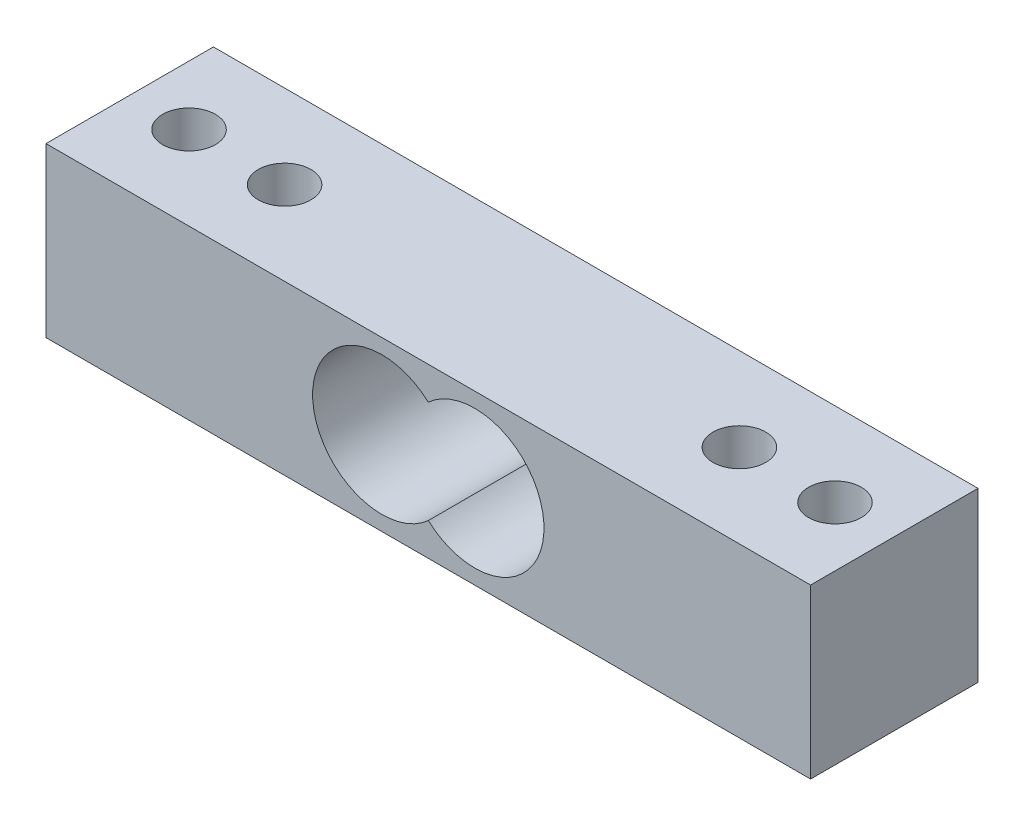
ISO-10303-21;
HEADER;
FILE_DESCRIPTION(('STEP AP214'),'2;1');
FILE_NAME('part.step','',(''),(''),'','','');
FILE_SCHEMA(('AUTOMOTIVE_DESIGN { 1 0 10303 214 1 1 1 1 }'));
ENDSEC;
DATA;
#1=APPLICATION_CONTEXT('core data for automotive mechanical design processes');
#2=APPLICATION_PROTOCOL_DEFINITION('international standard','automotive_design',2000,#1);
#3=PRODUCT_CONTEXT('',#1,'mechanical');
#4=PRODUCT('Part','Part','',(#3));
#5=PRODUCT_RELATED_PRODUCT_CATEGORY('part','',(#4));
#6=PRODUCT_DEFINITION_FORMATION('','',#4);
#7=PRODUCT_DEFINITION_CONTEXT('part definition',#1,'design');
#8=PRODUCT_DEFINITION('design','',#6,#7);
#9=PRODUCT_DEFINITION_SHAPE('','',#8);
#10=(LENGTH_UNIT() NAMED_UNIT(*) SI_UNIT(.MILLI.,.METRE.));
#11=(NAMED_UNIT(*) PLANE_ANGLE_UNIT() SI_UNIT($,.RADIAN.));
#12=(NAMED_UNIT(*) SI_UNIT($,.STERADIAN.) SOLID_ANGLE_UNIT());
#13=UNCERTAINTY_MEASURE_WITH_UNIT(LENGTH_MEASURE(1.E-05),#10,'distance_accuracy_value','');
#14=(GEOMETRIC_REPRESENTATION_CONTEXT(3) GLOBAL_UNCERTAINTY_ASSIGNED_CONTEXT((#13)) GLOBAL_UNIT_ASSIGNED_CONTEXT((#10,
#11,#12)) REPRESENTATION_CONTEXT('',''));
#15=CARTESIAN_POINT('',(0.,0.,0.));
#16=DIRECTION('',(0.,0.,1.));
#17=DIRECTION('',(1.,0.,0.));
#18=AXIS2_PLACEMENT_3D('',#15,#16,#17);
#19=CARTESIAN_POINT('',(0.,12.75,0.));
#20=DIRECTION('',(0.,-1.,0.));
#21=DIRECTION('',(0.,0.,-1.));
#22=AXIS2_PLACEMENT_3D('',#19,#20,#21);
#23=PLANE('',#22);
#24=DIRECTION('',(0.,0.,-1.));
#25=VECTOR('',#24,1.);
#26=CARTESIAN_POINT('',(29.,12.75,6.35));
#27=LINE('',#26,#25);
#28=CARTESIAN_POINT('',(29.,12.75,6.35));
#29=VERTEX_POINT('',#28);
#30=CARTESIAN_POINT('',(29.,12.75,-6.35));
#31=VERTEX_POINT('',#30);
#32=EDGE_CURVE('E170',#29,#31,#27,.T.);
#33=ORIENTED_EDGE('',*,*,#32,.T.);
#34=DIRECTION('',(-1.,0.,0.));
#35=VECTOR('',#34,1.);
#36=CARTESIAN_POINT('',(-29.,12.75,-6.35));
#37=LINE('',#36,#35);
#38=CARTESIAN_POINT('',(-29.,12.75,-6.35));
#39=VERTEX_POINT('',#38);
#40=EDGE_CURVE('E174',#31,#39,#37,.T.);
#41=ORIENTED_EDGE('',*,*,#40,.T.);
#42=DIRECTION('',(0.,0.,1.));
#43=VECTOR('',#42,1.);
#44=CARTESIAN_POINT('',(-29.,12.75,6.35));
#45=LINE('',#44,#43);
#46=CARTESIAN_POINT('',(-29.,12.75,6.35));
#47=VERTEX_POINT('',#46);
#48=EDGE_CURVE('E178',#39,#47,#45,.T.);
#49=ORIENTED_EDGE('',*,*,#48,.T.);
#50=DIRECTION('',(1.,0.,0.));
#51=VECTOR('',#50,1.);
#52=CARTESIAN_POINT('',(-29.,12.75,6.35));
#53=LINE('',#52,#51);
#54=EDGE_CURVE('E181',#47,#29,#53,.T.);
#55=ORIENTED_EDGE('',*,*,#54,.T.);
#56=EDGE_LOOP('',(#33,#41,#49,#55));
#57=FACE_BOUND('',#56,.T.);
#58=CARTESIAN_POINT('',(-24.5,12.75,0.));
#59=DIRECTION('',(0.,1.,0.));
#60=DIRECTION('',(0.,0.,1.));
#61=AXIS2_PLACEMENT_3D('',#58,#59,#60);
#62=CIRCLE('',#61,2.);
#63=CARTESIAN_POINT('',(-24.5,12.75,2.));
#64=VERTEX_POINT('',#63);
#65=EDGE_CURVE('E162',#64,#64,#62,.T.);
#66=ORIENTED_EDGE('',*,*,#65,.F.);
#67=EDGE_LOOP('',(#66));
#68=FACE_BOUND('',#67,.T.);
#69=CARTESIAN_POINT('',(-17.25,12.75,0.));
#70=DIRECTION('',(0.,1.,0.));
#71=DIRECTION('',(0.,0.,1.));
#72=AXIS2_PLACEMENT_3D('',#69,#70,#71);
#73=CIRCLE('',#72,2.);
#74=CARTESIAN_POINT('',(-17.25,12.75,2.));
#75=VERTEX_POINT('',#74);
#76=EDGE_CURVE('E154',#75,#75,#73,.T.);
#77=ORIENTED_EDGE('',*,*,#76,.F.);
#78=EDGE_LOOP('',(#77));
#79=FACE_BOUND('',#78,.T.);
#80=CARTESIAN_POINT('',(24.5,12.75,0.));
#81=DIRECTION('',(0.,1.,0.));
#82=DIRECTION('',(0.,0.,1.));
#83=AXIS2_PLACEMENT_3D('',#80,#81,#82);
#84=CIRCLE('',#83,2.);
#85=CARTESIAN_POINT('',(24.5,12.75,2.));
#86=VERTEX_POINT('',#85);
#87=EDGE_CURVE('E146',#86,#86,#84,.T.);
#88=ORIENTED_EDGE('',*,*,#87,.F.);
#89=EDGE_LOOP('',(#88));
#90=FACE_BOUND('',#89,.T.);
#91=CARTESIAN_POINT('',(17.25,12.75,0.));
#92=DIRECTION('',(0.,1.,0.));
#93=DIRECTION('',(0.,0.,1.));
#94=AXIS2_PLACEMENT_3D('',#91,#92,#93);
#95=CIRCLE('',#94,2.);
#96=CARTESIAN_POINT('',(17.25,12.75,2.));
#97=VERTEX_POINT('',#96);
#98=EDGE_CURVE('E138',#97,#97,#95,.T.);
#99=ORIENTED_EDGE('',*,*,#98,.F.);
#100=EDGE_LOOP('',(#99));
#101=FACE_BOUND('',#100,.T.);
#102=ADVANCED_FACE('F67',(#57,#68,#79,#90,#101),#23,.F.);
#103=CARTESIAN_POINT('',(0.,0.,0.));
#104=DIRECTION('',(0.,-1.,0.));
#105=DIRECTION('',(0.,0.,-1.));
#106=AXIS2_PLACEMENT_3D('',#103,#104,#105);
#107=PLANE('',#106);
#108=CARTESIAN_POINT('',(24.5,0.,0.));
#109=DIRECTION('',(0.,1.,0.));
#110=DIRECTION('',(0.,0.,1.));
#111=AXIS2_PLACEMENT_3D('',#108,#109,#110);
#112=CIRCLE('',#111,2.);
#113=CARTESIAN_POINT('',(24.5,0.,2.));
#114=VERTEX_POINT('',#113);
#115=EDGE_CURVE('E142',#114,#114,#112,.T.);
#116=ORIENTED_EDGE('',*,*,#115,.T.);
#117=EDGE_LOOP('',(#116));
#118=FACE_BOUND('',#117,.T.);
#119=CARTESIAN_POINT('',(-24.5,0.,0.));
#120=DIRECTION('',(0.,1.,0.));
#121=DIRECTION('',(0.,0.,1.));
#122=AXIS2_PLACEMENT_3D('',#119,#120,#121);
#123=CIRCLE('',#122,2.);
#124=CARTESIAN_POINT('',(-24.5,0.,2.));
#125=VERTEX_POINT('',#124);
#126=EDGE_CURVE('E158',#125,#125,#123,.T.);
#127=ORIENTED_EDGE('',*,*,#126,.T.);
#128=EDGE_LOOP('',(#127));
#129=FACE_BOUND('',#128,.T.);
#130=DIRECTION('',(0.,0.,-1.));
#131=VECTOR('',#130,1.);
#132=CARTESIAN_POINT('',(29.,0.,6.35));
#133=LINE('',#132,#131);
#134=CARTESIAN_POINT('',(29.,0.,6.35));
#135=VERTEX_POINT('',#134);
#136=CARTESIAN_POINT('',(29.,0.,-6.35));
#137=VERTEX_POINT('',#136);
#138=EDGE_CURVE('E166',#135,#137,#133,.T.);
#139=ORIENTED_EDGE('',*,*,#138,.F.);
#140=DIRECTION('',(1.,0.,0.));
#141=VECTOR('',#140,1.);
#142=CARTESIAN_POINT('',(-29.,0.,6.35));
#143=LINE('',#142,#141);
#144=CARTESIAN_POINT('',(-29.,0.,6.35));
#145=VERTEX_POINT('',#144);
#146=EDGE_CURVE('E175',#145,#135,#143,.T.);
#147=ORIENTED_EDGE('',*,*,#146,.F.);
#148=DIRECTION('',(0.,0.,1.));
#149=VECTOR('',#148,1.);
#150=CARTESIAN_POINT('',(-29.,0.,6.35));
#151=LINE('',#150,#149);
#152=CARTESIAN_POINT('',(-29.,0.,-6.35));
#153=VERTEX_POINT('',#152);
#154=EDGE_CURVE('E191',#153,#145,#151,.T.);
#155=ORIENTED_EDGE('',*,*,#154,.F.);
#156=DIRECTION('',(-1.,0.,0.));
#157=VECTOR('',#156,1.);
#158=CARTESIAN_POINT('',(-29.,0.,-6.35));
#159=LINE('',#158,#157);
#160=EDGE_CURVE('E188',#137,#153,#159,.T.);
#161=ORIENTED_EDGE('',*,*,#160,.F.);
#162=EDGE_LOOP('',(#139,#147,#155,#161));
#163=FACE_BOUND('',#162,.T.);
#164=CARTESIAN_POINT('',(-17.25,0.,0.));
#165=DIRECTION('',(0.,1.,0.));
#166=DIRECTION('',(0.,0.,1.));
#167=AXIS2_PLACEMENT_3D('',#164,#165,#166);
#168=CIRCLE('',#167,2.);
#169=CARTESIAN_POINT('',(-17.25,0.,2.));
#170=VERTEX_POINT('',#169);
#171=EDGE_CURVE('E150',#170,#170,#168,.T.);
#172=ORIENTED_EDGE('',*,*,#171,.T.);
#173=EDGE_LOOP('',(#172));
#174=FACE_BOUND('',#173,.T.);
#175=CARTESIAN_POINT('',(17.25,0.,0.));
#176=DIRECTION('',(0.,1.,0.));
#177=DIRECTION('',(0.,0.,1.));
#178=AXIS2_PLACEMENT_3D('',#175,#176,#177);
#179=CIRCLE('',#178,2.);
#180=CARTESIAN_POINT('',(17.25,0.,2.));
#181=VERTEX_POINT('',#180);
#182=EDGE_CURVE('E122',#181,#181,#179,.T.);
#183=ORIENTED_EDGE('',*,*,#182,.T.);
#184=EDGE_LOOP('',(#183));
#185=FACE_BOUND('',#184,.T.);
#186=ADVANCED_FACE('F228',(#118,#129,#163,#174,#185),#107,.T.);
#187=CARTESIAN_POINT('',(29.,12.75,6.35));
#188=DIRECTION('',(-1.,0.,0.));
#189=DIRECTION('',(0.,0.,1.));
#190=AXIS2_PLACEMENT_3D('',#187,#188,#189);
#191=PLANE('',#190);
#192=ORIENTED_EDGE('',*,*,#138,.T.);
#193=DIRECTION('',(0.,-1.,0.));
#194=VECTOR('',#193,1.);
#195=CARTESIAN_POINT('',(29.,12.75,-6.35));
#196=LINE('',#195,#194);
#197=EDGE_CURVE('E207',#31,#137,#196,.T.);
#198=ORIENTED_EDGE('',*,*,#197,.F.);
#199=ORIENTED_EDGE('',*,*,#32,.F.);
#200=DIRECTION('',(0.,-1.,0.));
#201=VECTOR('',#200,1.);
#202=CARTESIAN_POINT('',(29.,12.75,6.35));
#203=LINE('',#202,#201);
#204=EDGE_CURVE('E184',#29,#135,#203,.T.);
#205=ORIENTED_EDGE('',*,*,#204,.T.);
#206=EDGE_LOOP('',(#192,#198,#199,#205));
#207=FACE_BOUND('',#206,.T.);
#208=ADVANCED_FACE('F69',(#207),#191,.F.);
#209=CARTESIAN_POINT('',(-29.,12.75,-6.35));
#210=DIRECTION('',(0.,0.,1.));
#211=DIRECTION('',(1.,0.,0.));
#212=AXIS2_PLACEMENT_3D('',#209,#210,#211);
#213=PLANE('',#212);
#214=CARTESIAN_POINT('',(-3.525,6.375,-6.35));
#215=DIRECTION('',(0.,0.,1.));
#216=DIRECTION('',(1.,0.,0.));
#217=AXIS2_PLACEMENT_3D('',#214,#215,#216);
#218=CIRCLE('',#217,5.25);
#219=CARTESIAN_POINT('',(0.,10.2656137048029,-6.35));
#220=VERTEX_POINT('',#219);
#221=CARTESIAN_POINT('',(0.,2.48438629519712,-6.35));
#222=VERTEX_POINT('',#221);
#223=EDGE_CURVE('E126',#220,#222,#218,.T.);
#224=ORIENTED_EDGE('',*,*,#223,.T.);
#225=CARTESIAN_POINT('',(3.525,6.375,-6.35));
#226=DIRECTION('',(0.,0.,1.));
#227=DIRECTION('',(1.,0.,0.));
#228=AXIS2_PLACEMENT_3D('',#225,#226,#227);
#229=CIRCLE('',#228,5.25);
#230=EDGE_CURVE('E83',#222,#220,#229,.T.);
#231=ORIENTED_EDGE('',*,*,#230,.T.);
#232=EDGE_LOOP('',(#224,#231));
#233=FACE_BOUND('',#232,.T.);
#234=ORIENTED_EDGE('',*,*,#160,.T.);
#235=DIRECTION('',(0.,-1.,0.));
#236=VECTOR('',#235,1.);
#237=CARTESIAN_POINT('',(-29.,12.75,-6.35));
#238=LINE('',#237,#236);
#239=EDGE_CURVE('E203',#39,#153,#238,.T.);
#240=ORIENTED_EDGE('',*,*,#239,.F.);
#241=ORIENTED_EDGE('',*,*,#40,.F.);
#242=ORIENTED_EDGE('',*,*,#197,.T.);
#243=EDGE_LOOP('',(#234,#240,#241,#242));
#244=FACE_BOUND('',#243,.T.);
#245=ADVANCED_FACE('F131',(#233,#244),#213,.F.);
#246=CARTESIAN_POINT('',(-29.,12.75,6.35));
#247=DIRECTION('',(1.,0.,0.));
#248=DIRECTION('',(0.,0.,-1.));
#249=AXIS2_PLACEMENT_3D('',#246,#247,#248);
#250=PLANE('',#249);
#251=ORIENTED_EDGE('',*,*,#154,.T.);
#252=DIRECTION('',(0.,-1.,0.));
#253=VECTOR('',#252,1.);
#254=CARTESIAN_POINT('',(-29.,12.75,6.35));
#255=LINE('',#254,#253);
#256=EDGE_CURVE('E199',#47,#145,#255,.T.);
#257=ORIENTED_EDGE('',*,*,#256,.F.);
#258=ORIENTED_EDGE('',*,*,#48,.F.);
#259=ORIENTED_EDGE('',*,*,#239,.T.);
#260=EDGE_LOOP('',(#251,#257,#258,#259));
#261=FACE_BOUND('',#260,.T.);
#262=ADVANCED_FACE('F216',(#261),#250,.F.);
#263=CARTESIAN_POINT('',(-29.,12.75,6.35));
#264=DIRECTION('',(0.,0.,-1.));
#265=DIRECTION('',(-1.,0.,0.));
#266=AXIS2_PLACEMENT_3D('',#263,#264,#265);
#267=PLANE('',#266);
#268=CARTESIAN_POINT('',(-3.525,6.375,6.35));
#269=DIRECTION('',(0.,0.,-1.));
#270=DIRECTION('',(-1.,0.,0.));
#271=AXIS2_PLACEMENT_3D('',#268,#269,#270);
#272=CIRCLE('',#271,5.25);
#273=CARTESIAN_POINT('',(0.,2.48438629519712,6.35));
#274=VERTEX_POINT('',#273);
#275=CARTESIAN_POINT('',(0.,10.2656137048029,6.35));
#276=VERTEX_POINT('',#275);
#277=EDGE_CURVE('E76',#274,#276,#272,.T.);
#278=ORIENTED_EDGE('',*,*,#277,.T.);
#279=CARTESIAN_POINT('',(3.525,6.375,6.35));
#280=DIRECTION('',(0.,0.,-1.));
#281=DIRECTION('',(-1.,0.,0.));
#282=AXIS2_PLACEMENT_3D('',#279,#280,#281);
#283=CIRCLE('',#282,5.25);
#284=EDGE_CURVE('E12',#276,#274,#283,.T.);
#285=ORIENTED_EDGE('',*,*,#284,.T.);
#286=EDGE_LOOP('',(#278,#285));
#287=FACE_BOUND('',#286,.T.);
#288=ORIENTED_EDGE('',*,*,#146,.T.);
#289=ORIENTED_EDGE('',*,*,#204,.F.);
#290=ORIENTED_EDGE('',*,*,#54,.F.);
#291=ORIENTED_EDGE('',*,*,#256,.T.);
#292=EDGE_LOOP('',(#288,#289,#290,#291));
#293=FACE_BOUND('',#292,.T.);
#294=ADVANCED_FACE('F212',(#287,#293),#267,.F.);
#295=CARTESIAN_POINT('',(-24.5,12.75,0.));
#296=DIRECTION('',(0.,-1.,0.));
#297=DIRECTION('',(0.,0.,-1.));
#298=AXIS2_PLACEMENT_3D('',#295,#296,#297);
#299=CYLINDRICAL_SURFACE('',#298,2.);
#300=ORIENTED_EDGE('',*,*,#65,.T.);
#301=EDGE_LOOP('',(#300));
#302=FACE_BOUND('',#301,.T.);
#303=ORIENTED_EDGE('',*,*,#126,.F.);
#304=EDGE_LOOP('',(#303));
#305=FACE_BOUND('',#304,.T.);
#306=ADVANCED_FACE('F215',(#302,#305),#299,.F.);
#307=CARTESIAN_POINT('',(-17.25,12.75,0.));
#308=DIRECTION('',(0.,-1.,0.));
#309=DIRECTION('',(0.,0.,-1.));
#310=AXIS2_PLACEMENT_3D('',#307,#308,#309);
#311=CYLINDRICAL_SURFACE('',#310,2.);
#312=ORIENTED_EDGE('',*,*,#76,.T.);
#313=EDGE_LOOP('',(#312));
#314=FACE_BOUND('',#313,.T.);
#315=ORIENTED_EDGE('',*,*,#171,.F.);
#316=EDGE_LOOP('',(#315));
#317=FACE_BOUND('',#316,.T.);
#318=ADVANCED_FACE('F250',(#314,#317),#311,.F.);
#319=CARTESIAN_POINT('',(24.5,12.75,0.));
#320=DIRECTION('',(0.,-1.,0.));
#321=DIRECTION('',(0.,0.,-1.));
#322=AXIS2_PLACEMENT_3D('',#319,#320,#321);
#323=CYLINDRICAL_SURFACE('',#322,2.);
#324=ORIENTED_EDGE('',*,*,#87,.T.);
#325=EDGE_LOOP('',(#324));
#326=FACE_BOUND('',#325,.T.);
#327=ORIENTED_EDGE('',*,*,#115,.F.);
#328=EDGE_LOOP('',(#327));
#329=FACE_BOUND('',#328,.T.);
#330=ADVANCED_FACE('F254',(#326,#329),#323,.F.);
#331=CARTESIAN_POINT('',(17.25,12.75,0.));
#332=DIRECTION('',(0.,-1.,0.));
#333=DIRECTION('',(0.,0.,-1.));
#334=AXIS2_PLACEMENT_3D('',#331,#332,#333);
#335=CYLINDRICAL_SURFACE('',#334,2.);
#336=ORIENTED_EDGE('',*,*,#98,.T.);
#337=EDGE_LOOP('',(#336));
#338=FACE_BOUND('',#337,.T.);
#339=ORIENTED_EDGE('',*,*,#182,.F.);
#340=EDGE_LOOP('',(#339));
#341=FACE_BOUND('',#340,.T.);
#342=ADVANCED_FACE('F258',(#338,#341),#335,.F.);
#343=CARTESIAN_POINT('',(3.525,6.375,-6.35));
#344=DIRECTION('',(0.,0.,1.));
#345=DIRECTION('',(1.,0.,0.));
#346=AXIS2_PLACEMENT_3D('',#343,#344,#345);
#347=CYLINDRICAL_SURFACE('',#346,5.25);
#348=DIRECTION('',(0.,0.,1.));
#349=VECTOR('',#348,1.);
#350=CARTESIAN_POINT('',(0.,10.2656137048029,-6.35));
#351=LINE('',#350,#349);
#352=EDGE_CURVE('E90',#220,#276,#351,.T.);
#353=ORIENTED_EDGE('',*,*,#352,.F.);
#354=ORIENTED_EDGE('',*,*,#230,.F.);
#355=DIRECTION('',(0.,0.,1.));
#356=VECTOR('',#355,1.);
#357=CARTESIAN_POINT('',(0.,2.48438629519712,-6.35));
#358=LINE('',#357,#356);
#359=EDGE_CURVE('E123',#222,#274,#358,.T.);
#360=ORIENTED_EDGE('',*,*,#359,.T.);
#361=ORIENTED_EDGE('',*,*,#284,.F.);
#362=EDGE_LOOP('',(#353,#354,#360,#361));
#363=FACE_BOUND('',#362,.T.);
#364=ADVANCED_FACE('F119',(#363),#347,.F.);
#365=CARTESIAN_POINT('',(-3.525,6.375,-6.35));
#366=DIRECTION('',(0.,0.,1.));
#367=DIRECTION('',(1.,0.,0.));
#368=AXIS2_PLACEMENT_3D('',#365,#366,#367);
#369=CYLINDRICAL_SURFACE('',#368,5.25);
#370=ORIENTED_EDGE('',*,*,#359,.F.);
#371=ORIENTED_EDGE('',*,*,#223,.F.);
#372=ORIENTED_EDGE('',*,*,#352,.T.);
#373=ORIENTED_EDGE('',*,*,#277,.F.);
#374=EDGE_LOOP('',(#370,#371,#372,#373));
#375=FACE_BOUND('',#374,.T.);
#376=ADVANCED_FACE('F127',(#375),#369,.F.);
#377=CLOSED_SHELL('',(#102,#186,#208,#245,#262,#294,#306,#318,#330,#342,#364,#376));
#378=MANIFOLD_SOLID_BREP('B2',#377);
#379=ADVANCED_BREP_SHAPE_REPRESENTATION('',(#18,#378),#14);
#380=SHAPE_DEFINITION_REPRESENTATION(#9,#379);
ENDSEC;
END-ISO-10303-21;
